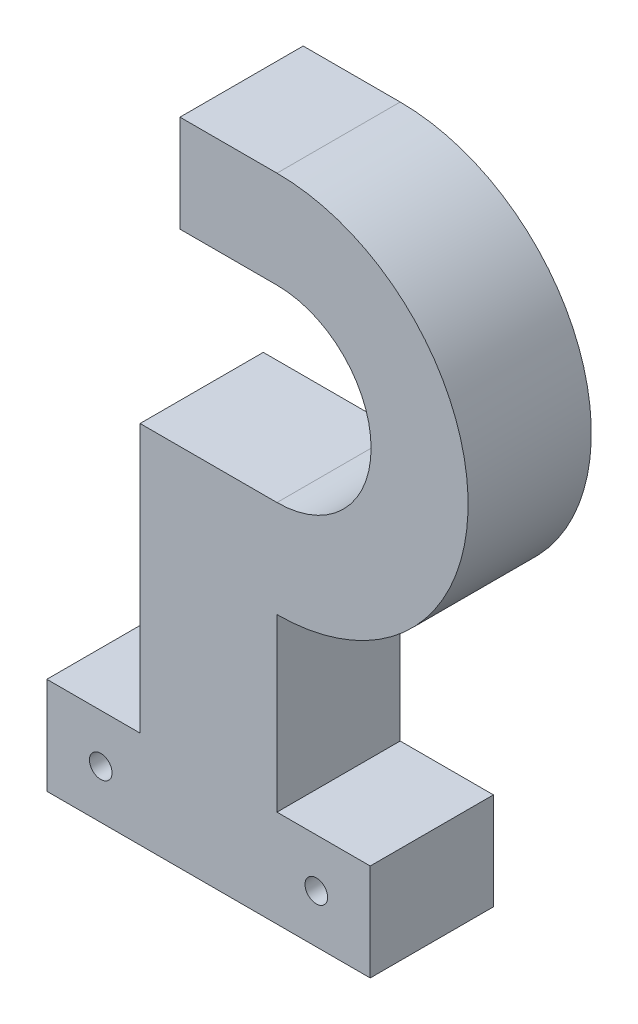
ISO-10303-21;
HEADER;
FILE_DESCRIPTION(('STEP AP214'),'2;1');
FILE_NAME('part.step','',(''),(''),'','','');
FILE_SCHEMA(('AUTOMOTIVE_DESIGN { 1 0 10303 214 1 1 1 1 }'));
ENDSEC;
DATA;
#1=APPLICATION_CONTEXT('core data for automotive mechanical design processes');
#2=APPLICATION_PROTOCOL_DEFINITION('international standard','automotive_design',2000,#1);
#3=PRODUCT_CONTEXT('',#1,'mechanical');
#4=PRODUCT('Part','Part','',(#3));
#5=PRODUCT_RELATED_PRODUCT_CATEGORY('part','',(#4));
#6=PRODUCT_DEFINITION_FORMATION('','',#4);
#7=PRODUCT_DEFINITION_CONTEXT('part definition',#1,'design');
#8=PRODUCT_DEFINITION('design','',#6,#7);
#9=PRODUCT_DEFINITION_SHAPE('','',#8);
#10=(LENGTH_UNIT() NAMED_UNIT(*) SI_UNIT(.MILLI.,.METRE.));
#11=(NAMED_UNIT(*) PLANE_ANGLE_UNIT() SI_UNIT($,.RADIAN.));
#12=(NAMED_UNIT(*) SI_UNIT($,.STERADIAN.) SOLID_ANGLE_UNIT());
#13=UNCERTAINTY_MEASURE_WITH_UNIT(LENGTH_MEASURE(1.E-05),#10,'distance_accuracy_value','');
#14=(GEOMETRIC_REPRESENTATION_CONTEXT(3) GLOBAL_UNCERTAINTY_ASSIGNED_CONTEXT((#13)) GLOBAL_UNIT_ASSIGNED_CONTEXT((#10,
#11,#12)) REPRESENTATION_CONTEXT('',''));
#15=CARTESIAN_POINT('',(0.,0.,0.));
#16=DIRECTION('',(0.,0.,1.));
#17=DIRECTION('',(1.,0.,0.));
#18=AXIS2_PLACEMENT_3D('',#15,#16,#17);
#19=CARTESIAN_POINT('',(-28.0637741,0.,-29.21));
#20=DIRECTION('',(-1.,0.,0.));
#21=DIRECTION('',(0.,0.,1.));
#22=AXIS2_PLACEMENT_3D('',#19,#20,#21);
#23=PLANE('',#22);
#24=DIRECTION('',(0.,-1.,0.));
#25=VECTOR('',#24,1.);
#26=CARTESIAN_POINT('',(-28.0637741,0.,-6.35));
#27=LINE('',#26,#25);
#28=CARTESIAN_POINT('',(-28.0637741,-30.,-6.35));
#29=VERTEX_POINT('',#28);
#30=CARTESIAN_POINT('',(-28.0637741,-79.75,-6.35));
#31=VERTEX_POINT('',#30);
#32=EDGE_CURVE('E173',#29,#31,#27,.T.);
#33=ORIENTED_EDGE('',*,*,#32,.F.);
#34=DIRECTION('',(0.,0.,1.));
#35=VECTOR('',#34,1.);
#36=CARTESIAN_POINT('',(-28.0637741,-30.,-29.21));
#37=LINE('',#36,#35);
#38=CARTESIAN_POINT('',(-28.0637741,-30.,-29.21));
#39=VERTEX_POINT('',#38);
#40=EDGE_CURVE('E11',#39,#29,#37,.T.);
#41=ORIENTED_EDGE('',*,*,#40,.F.);
#42=DIRECTION('',(0.,-1.,0.));
#43=VECTOR('',#42,1.);
#44=CARTESIAN_POINT('',(-28.0637741,0.,-29.21));
#45=LINE('',#44,#43);
#46=CARTESIAN_POINT('',(-28.0637741,-79.75,-29.21));
#47=VERTEX_POINT('',#46);
#48=EDGE_CURVE('E149',#39,#47,#45,.T.);
#49=ORIENTED_EDGE('',*,*,#48,.T.);
#50=DIRECTION('',(0.,0.,-1.));
#51=VECTOR('',#50,1.);
#52=CARTESIAN_POINT('',(-28.0637741,-79.75,-6.35));
#53=LINE('',#52,#51);
#54=EDGE_CURVE('E212',#31,#47,#53,.T.);
#55=ORIENTED_EDGE('',*,*,#54,.F.);
#56=EDGE_LOOP('',(#33,#41,#49,#55));
#57=FACE_BOUND('',#56,.T.);
#58=ADVANCED_FACE('F47',(#57),#23,.T.);
#59=CARTESIAN_POINT('',(0.,-30.,-29.21));
#60=DIRECTION('',(0.,1.,0.));
#61=DIRECTION('',(0.,0.,1.));
#62=AXIS2_PLACEMENT_3D('',#59,#60,#61);
#63=PLANE('',#62);
#64=DIRECTION('',(-1.,0.,0.));
#65=VECTOR('',#64,1.);
#66=CARTESIAN_POINT('',(0.,-30.,-6.35));
#67=LINE('',#66,#65);
#68=CARTESIAN_POINT('',(-2.66377258,-30.,-6.35));
#69=VERTEX_POINT('',#68);
#70=EDGE_CURVE('E170',#69,#29,#67,.T.);
#71=ORIENTED_EDGE('',*,*,#70,.F.);
#72=DIRECTION('',(0.,0.,1.));
#73=VECTOR('',#72,1.);
#74=CARTESIAN_POINT('',(-2.66377258,-30.,-29.21));
#75=LINE('',#74,#73);
#76=CARTESIAN_POINT('',(-2.66377258,-30.,-29.21));
#77=VERTEX_POINT('',#76);
#78=EDGE_CURVE('E58',#77,#69,#75,.T.);
#79=ORIENTED_EDGE('',*,*,#78,.F.);
#80=DIRECTION('',(-1.,0.,0.));
#81=VECTOR('',#80,1.);
#82=CARTESIAN_POINT('',(0.,-30.,-29.21));
#83=LINE('',#82,#81);
#84=EDGE_CURVE('E126',#77,#39,#83,.T.);
#85=ORIENTED_EDGE('',*,*,#84,.T.);
#86=ORIENTED_EDGE('',*,*,#40,.T.);
#87=EDGE_LOOP('',(#71,#79,#85,#86));
#88=FACE_BOUND('',#87,.T.);
#89=ADVANCED_FACE('F222',(#88),#63,.T.);
#90=CARTESIAN_POINT('',(-2.66377258000001,-12.5375,-29.21));
#91=DIRECTION('',(0.,0.,1.));
#92=DIRECTION('',(1.,0.,0.));
#93=AXIS2_PLACEMENT_3D('',#90,#91,#92);
#94=CYLINDRICAL_SURFACE('',#93,17.4625);
#95=CARTESIAN_POINT('',(-2.66377258000001,-12.5375,-6.35));
#96=DIRECTION('',(0.,0.,1.));
#97=DIRECTION('',(1.,0.,0.));
#98=AXIS2_PLACEMENT_3D('',#95,#96,#97);
#99=CIRCLE('',#98,17.4625);
#100=CARTESIAN_POINT('',(-2.66377257999999,4.925,-6.35));
#101=VERTEX_POINT('',#100);
#102=EDGE_CURVE('E131',#69,#101,#99,.T.);
#103=ORIENTED_EDGE('',*,*,#102,.T.);
#104=DIRECTION('',(0.,0.,1.));
#105=VECTOR('',#104,1.);
#106=CARTESIAN_POINT('',(-2.66377257999999,4.925,-29.21));
#107=LINE('',#106,#105);
#108=CARTESIAN_POINT('',(-2.66377257999999,4.925,-29.21));
#109=VERTEX_POINT('',#108);
#110=EDGE_CURVE('E129',#109,#101,#107,.T.);
#111=ORIENTED_EDGE('',*,*,#110,.F.);
#112=CARTESIAN_POINT('',(-2.66377258000001,-12.5375,-29.21));
#113=DIRECTION('',(0.,0.,1.));
#114=DIRECTION('',(1.,0.,0.));
#115=AXIS2_PLACEMENT_3D('',#112,#113,#114);
#116=CIRCLE('',#115,17.4625);
#117=EDGE_CURVE('E117',#77,#109,#116,.T.);
#118=ORIENTED_EDGE('',*,*,#117,.F.);
#119=ORIENTED_EDGE('',*,*,#78,.T.);
#120=EDGE_LOOP('',(#103,#111,#118,#119));
#121=FACE_BOUND('',#120,.T.);
#122=ADVANCED_FACE('F130',(#121),#94,.F.);
#123=CARTESIAN_POINT('',(0.,4.925,-29.21));
#124=DIRECTION('',(0.,-1.,0.));
#125=DIRECTION('',(0.,0.,-1.));
#126=AXIS2_PLACEMENT_3D('',#123,#124,#125);
#127=PLANE('',#126);
#128=DIRECTION('',(1.,0.,0.));
#129=VECTOR('',#128,1.);
#130=CARTESIAN_POINT('',(0.,4.925,-6.35));
#131=LINE('',#130,#129);
#132=CARTESIAN_POINT('',(-20.6637745,4.925,-6.35));
#133=VERTEX_POINT('',#132);
#134=EDGE_CURVE('E165',#133,#101,#131,.T.);
#135=ORIENTED_EDGE('',*,*,#134,.F.);
#136=DIRECTION('',(0.,0.,1.));
#137=VECTOR('',#136,1.);
#138=CARTESIAN_POINT('',(-20.6637745,4.925,-29.21));
#139=LINE('',#138,#137);
#140=CARTESIAN_POINT('',(-20.6637745,4.925,-29.21));
#141=VERTEX_POINT('',#140);
#142=EDGE_CURVE('E136',#141,#133,#139,.T.);
#143=ORIENTED_EDGE('',*,*,#142,.F.);
#144=DIRECTION('',(1.,0.,0.));
#145=VECTOR('',#144,1.);
#146=CARTESIAN_POINT('',(0.,4.925,-29.21));
#147=LINE('',#146,#145);
#148=EDGE_CURVE('E123',#141,#109,#147,.T.);
#149=ORIENTED_EDGE('',*,*,#148,.T.);
#150=ORIENTED_EDGE('',*,*,#110,.T.);
#151=EDGE_LOOP('',(#135,#143,#149,#150));
#152=FACE_BOUND('',#151,.T.);
#153=ADVANCED_FACE('F138',(#152),#127,.T.);
#154=CARTESIAN_POINT('',(-20.6637745,0.,-29.21));
#155=DIRECTION('',(-1.,0.,0.));
#156=DIRECTION('',(0.,0.,1.));
#157=AXIS2_PLACEMENT_3D('',#154,#155,#156);
#158=PLANE('',#157);
#159=DIRECTION('',(0.,-1.,0.));
#160=VECTOR('',#159,1.);
#161=CARTESIAN_POINT('',(-20.6637745,0.,-6.35));
#162=LINE('',#161,#160);
#163=CARTESIAN_POINT('',(-20.6637745,22.925,-6.35));
#164=VERTEX_POINT('',#163);
#165=EDGE_CURVE('E161',#164,#133,#162,.T.);
#166=ORIENTED_EDGE('',*,*,#165,.F.);
#167=DIRECTION('',(0.,0.,1.));
#168=VECTOR('',#167,1.);
#169=CARTESIAN_POINT('',(-20.6637745,22.925,-29.21));
#170=LINE('',#169,#168);
#171=CARTESIAN_POINT('',(-20.6637745,22.925,-29.21));
#172=VERTEX_POINT('',#171);
#173=EDGE_CURVE('E182',#172,#164,#170,.T.);
#174=ORIENTED_EDGE('',*,*,#173,.F.);
#175=DIRECTION('',(0.,-1.,0.));
#176=VECTOR('',#175,1.);
#177=CARTESIAN_POINT('',(-20.6637745,0.,-29.21));
#178=LINE('',#177,#176);
#179=EDGE_CURVE('E140',#172,#141,#178,.T.);
#180=ORIENTED_EDGE('',*,*,#179,.T.);
#181=ORIENTED_EDGE('',*,*,#142,.T.);
#182=EDGE_LOOP('',(#166,#174,#180,#181));
#183=FACE_BOUND('',#182,.T.);
#184=ADVANCED_FACE('F221',(#183),#158,.T.);
#185=CARTESIAN_POINT('',(0.,22.925,-29.21));
#186=DIRECTION('',(0.,1.,0.));
#187=DIRECTION('',(0.,0.,1.));
#188=AXIS2_PLACEMENT_3D('',#185,#186,#187);
#189=PLANE('',#188);
#190=DIRECTION('',(-1.,0.,0.));
#191=VECTOR('',#190,1.);
#192=CARTESIAN_POINT('',(0.,22.925,-6.35));
#193=LINE('',#192,#191);
#194=CARTESIAN_POINT('',(-2.66377257999999,22.925,-6.35));
#195=VERTEX_POINT('',#194);
#196=EDGE_CURVE('E156',#195,#164,#193,.T.);
#197=ORIENTED_EDGE('',*,*,#196,.F.);
#198=DIRECTION('',(0.,0.,1.));
#199=VECTOR('',#198,1.);
#200=CARTESIAN_POINT('',(-2.66377257999999,22.925,-29.21));
#201=LINE('',#200,#199);
#202=CARTESIAN_POINT('',(-2.66377257999999,22.925,-29.21));
#203=VERTEX_POINT('',#202);
#204=EDGE_CURVE('E103',#203,#195,#201,.T.);
#205=ORIENTED_EDGE('',*,*,#204,.F.);
#206=DIRECTION('',(-1.,0.,0.));
#207=VECTOR('',#206,1.);
#208=CARTESIAN_POINT('',(0.,22.925,-29.21));
#209=LINE('',#208,#207);
#210=EDGE_CURVE('E143',#203,#172,#209,.T.);
#211=ORIENTED_EDGE('',*,*,#210,.T.);
#212=ORIENTED_EDGE('',*,*,#173,.T.);
#213=EDGE_LOOP('',(#197,#205,#211,#212));
#214=FACE_BOUND('',#213,.T.);
#215=ADVANCED_FACE('F218',(#214),#189,.T.);
#216=CARTESIAN_POINT('',(-2.66377258,-12.5375,-29.21));
#217=DIRECTION('',(0.,0.,1.));
#218=DIRECTION('',(1.,0.,0.));
#219=AXIS2_PLACEMENT_3D('',#216,#217,#218);
#220=CYLINDRICAL_SURFACE('',#219,35.4625);
#221=CARTESIAN_POINT('',(-2.66377258,-12.5375,-6.35));
#222=DIRECTION('',(0.,0.,1.));
#223=DIRECTION('',(1.,0.,0.));
#224=AXIS2_PLACEMENT_3D('',#221,#222,#223);
#225=CIRCLE('',#224,35.4625);
#226=CARTESIAN_POINT('',(-2.66377258,-48.,-6.35));
#227=VERTEX_POINT('',#226);
#228=EDGE_CURVE('E152',#227,#195,#225,.T.);
#229=ORIENTED_EDGE('',*,*,#228,.F.);
#230=DIRECTION('',(0.,0.,1.));
#231=VECTOR('',#230,1.);
#232=CARTESIAN_POINT('',(-2.66377258,-48.,-29.21));
#233=LINE('',#232,#231);
#234=CARTESIAN_POINT('',(-2.66377258,-48.,-29.21));
#235=VERTEX_POINT('',#234);
#236=EDGE_CURVE('E51',#235,#227,#233,.T.);
#237=ORIENTED_EDGE('',*,*,#236,.F.);
#238=CARTESIAN_POINT('',(-2.66377258,-12.5375,-29.21));
#239=DIRECTION('',(0.,0.,1.));
#240=DIRECTION('',(1.,0.,0.));
#241=AXIS2_PLACEMENT_3D('',#238,#239,#240);
#242=CIRCLE('',#241,35.4625);
#243=EDGE_CURVE('E176',#235,#203,#242,.T.);
#244=ORIENTED_EDGE('',*,*,#243,.T.);
#245=ORIENTED_EDGE('',*,*,#204,.T.);
#246=EDGE_LOOP('',(#229,#237,#244,#245));
#247=FACE_BOUND('',#246,.T.);
#248=ADVANCED_FACE('F49',(#247),#220,.T.);
#249=CARTESIAN_POINT('',(0.,0.,-29.21));
#250=DIRECTION('',(0.,0.,1.));
#251=DIRECTION('',(1.,0.,0.));
#252=AXIS2_PLACEMENT_3D('',#249,#250,#251);
#253=PLANE('',#252);
#254=CARTESIAN_POINT('',(4.636226792,-88.750000034,-29.21));
#255=DIRECTION('',(0.,0.,1.));
#256=DIRECTION('',(1.,0.,0.));
#257=AXIS2_PLACEMENT_3D('',#254,#255,#256);
#258=CIRCLE('',#257,2.10000176900001);
#259=CARTESIAN_POINT('',(6.736228561,-88.750000034,-29.21));
#260=VERTEX_POINT('',#259);
#261=EDGE_CURVE('E271',#260,#260,#258,.T.);
#262=ORIENTED_EDGE('',*,*,#261,.T.);
#263=EDGE_LOOP('',(#262));
#264=FACE_BOUND('',#263,.T.);
#265=CARTESIAN_POINT('',(-35.363773472,-88.750000034,-29.21));
#266=DIRECTION('',(0.,0.,1.));
#267=DIRECTION('',(1.,0.,0.));
#268=AXIS2_PLACEMENT_3D('',#265,#266,#267);
#269=CIRCLE('',#268,2.100001769);
#270=CARTESIAN_POINT('',(-33.263771703,-88.750000034,-29.21));
#271=VERTEX_POINT('',#270);
#272=EDGE_CURVE('E286',#271,#271,#269,.T.);
#273=ORIENTED_EDGE('',*,*,#272,.T.);
#274=EDGE_LOOP('',(#273));
#275=FACE_BOUND('',#274,.T.);
#276=ORIENTED_EDGE('',*,*,#243,.F.);
#277=DIRECTION('',(0.,1.,0.));
#278=VECTOR('',#277,1.);
#279=CARTESIAN_POINT('',(-2.66377258,-79.75,-29.21));
#280=LINE('',#279,#278);
#281=CARTESIAN_POINT('',(-2.66377258,-79.75,-29.21));
#282=VERTEX_POINT('',#281);
#283=EDGE_CURVE('E157',#282,#235,#280,.T.);
#284=ORIENTED_EDGE('',*,*,#283,.F.);
#285=DIRECTION('',(1.,0.,0.));
#286=VECTOR('',#285,1.);
#287=CARTESIAN_POINT('',(-15.36377334,-79.75,-29.21));
#288=LINE('',#287,#286);
#289=CARTESIAN_POINT('',(14.636226604,-79.75,-29.21));
#290=VERTEX_POINT('',#289);
#291=EDGE_CURVE('E274',#282,#290,#288,.T.);
#292=ORIENTED_EDGE('',*,*,#291,.T.);
#293=DIRECTION('',(0.,1.,0.));
#294=VECTOR('',#293,1.);
#295=CARTESIAN_POINT('',(14.636226604,-97.750000068,-29.21));
#296=LINE('',#295,#294);
#297=CARTESIAN_POINT('',(14.636226604,-97.750000068,-29.21));
#298=VERTEX_POINT('',#297);
#299=EDGE_CURVE('E275',#298,#290,#296,.T.);
#300=ORIENTED_EDGE('',*,*,#299,.F.);
#301=DIRECTION('',(1.,0.,0.));
#302=VECTOR('',#301,1.);
#303=CARTESIAN_POINT('',(-45.363773284,-97.750000068,-29.21));
#304=LINE('',#303,#302);
#305=CARTESIAN_POINT('',(-45.363773284,-97.750000068,-29.21));
#306=VERTEX_POINT('',#305);
#307=EDGE_CURVE('E279',#306,#298,#304,.T.);
#308=ORIENTED_EDGE('',*,*,#307,.F.);
#309=DIRECTION('',(0.,-1.,0.));
#310=VECTOR('',#309,1.);
#311=CARTESIAN_POINT('',(-45.363773284,-79.75,-29.21));
#312=LINE('',#311,#310);
#313=CARTESIAN_POINT('',(-45.363773284,-79.75,-29.21));
#314=VERTEX_POINT('',#313);
#315=EDGE_CURVE('E259',#314,#306,#312,.T.);
#316=ORIENTED_EDGE('',*,*,#315,.F.);
#317=EDGE_CURVE('E227',#314,#47,#288,.T.);
#318=ORIENTED_EDGE('',*,*,#317,.T.);
#319=ORIENTED_EDGE('',*,*,#48,.F.);
#320=ORIENTED_EDGE('',*,*,#84,.F.);
#321=ORIENTED_EDGE('',*,*,#117,.T.);
#322=ORIENTED_EDGE('',*,*,#148,.F.);
#323=ORIENTED_EDGE('',*,*,#179,.F.);
#324=ORIENTED_EDGE('',*,*,#210,.F.);
#325=EDGE_LOOP('',(#276,#284,#292,#300,#308,#316,#318,#319,#320,#321,#322,#323,#324));
#326=FACE_BOUND('',#325,.T.);
#327=ADVANCED_FACE('F120',(#264,#275,#326),#253,.F.);
#328=CARTESIAN_POINT('',(0.,0.,-6.35));
#329=DIRECTION('',(0.,0.,1.));
#330=DIRECTION('',(1.,0.,0.));
#331=AXIS2_PLACEMENT_3D('',#328,#329,#330);
#332=PLANE('',#331);
#333=CARTESIAN_POINT('',(4.636226792,-88.750000034,-6.35));
#334=DIRECTION('',(0.,0.,1.));
#335=DIRECTION('',(1.,0.,0.));
#336=AXIS2_PLACEMENT_3D('',#333,#334,#335);
#337=CIRCLE('',#336,2.10000176900001);
#338=CARTESIAN_POINT('',(6.736228561,-88.750000034,-6.35));
#339=VERTEX_POINT('',#338);
#340=EDGE_CURVE('E294',#339,#339,#337,.T.);
#341=ORIENTED_EDGE('',*,*,#340,.F.);
#342=EDGE_LOOP('',(#341));
#343=FACE_BOUND('',#342,.T.);
#344=CARTESIAN_POINT('',(-35.363773472,-88.750000034,-6.35));
#345=DIRECTION('',(0.,0.,1.));
#346=DIRECTION('',(1.,0.,0.));
#347=AXIS2_PLACEMENT_3D('',#344,#345,#346);
#348=CIRCLE('',#347,2.100001769);
#349=CARTESIAN_POINT('',(-33.263771703,-88.750000034,-6.35));
#350=VERTEX_POINT('',#349);
#351=EDGE_CURVE('E290',#350,#350,#348,.T.);
#352=ORIENTED_EDGE('',*,*,#351,.F.);
#353=EDGE_LOOP('',(#352));
#354=FACE_BOUND('',#353,.T.);
#355=ORIENTED_EDGE('',*,*,#32,.T.);
#356=DIRECTION('',(-1.,0.,0.));
#357=VECTOR('',#356,1.);
#358=CARTESIAN_POINT('',(-15.36377334,-79.75,-6.35));
#359=LINE('',#358,#357);
#360=CARTESIAN_POINT('',(-45.363773284,-79.75,-6.35));
#361=VERTEX_POINT('',#360);
#362=EDGE_CURVE('E239',#31,#361,#359,.T.);
#363=ORIENTED_EDGE('',*,*,#362,.T.);
#364=DIRECTION('',(0.,-1.,0.));
#365=VECTOR('',#364,1.);
#366=CARTESIAN_POINT('',(-45.363773284,-79.75,-6.35));
#367=LINE('',#366,#365);
#368=CARTESIAN_POINT('',(-45.363773284,-97.750000068,-6.35));
#369=VERTEX_POINT('',#368);
#370=EDGE_CURVE('E267',#361,#369,#367,.T.);
#371=ORIENTED_EDGE('',*,*,#370,.T.);
#372=DIRECTION('',(1.,0.,0.));
#373=VECTOR('',#372,1.);
#374=CARTESIAN_POINT('',(-45.363773284,-97.750000068,-6.35));
#375=LINE('',#374,#373);
#376=CARTESIAN_POINT('',(14.636226604,-97.750000068,-6.35));
#377=VERTEX_POINT('',#376);
#378=EDGE_CURVE('E263',#369,#377,#375,.T.);
#379=ORIENTED_EDGE('',*,*,#378,.T.);
#380=DIRECTION('',(0.,1.,0.));
#381=VECTOR('',#380,1.);
#382=CARTESIAN_POINT('',(14.636226604,-97.750000068,-6.35));
#383=LINE('',#382,#381);
#384=CARTESIAN_POINT('',(14.636226604,-79.75,-6.35));
#385=VERTEX_POINT('',#384);
#386=EDGE_CURVE('E260',#377,#385,#383,.T.);
#387=ORIENTED_EDGE('',*,*,#386,.T.);
#388=CARTESIAN_POINT('',(-2.66377258,-79.75,-6.35));
#389=VERTEX_POINT('',#388);
#390=EDGE_CURVE('E205',#385,#389,#359,.T.);
#391=ORIENTED_EDGE('',*,*,#390,.T.);
#392=DIRECTION('',(0.,1.,0.));
#393=VECTOR('',#392,1.);
#394=CARTESIAN_POINT('',(-2.66377258,-79.75,-6.35));
#395=LINE('',#394,#393);
#396=EDGE_CURVE('E197',#389,#227,#395,.T.);
#397=ORIENTED_EDGE('',*,*,#396,.T.);
#398=ORIENTED_EDGE('',*,*,#228,.T.);
#399=ORIENTED_EDGE('',*,*,#196,.T.);
#400=ORIENTED_EDGE('',*,*,#165,.T.);
#401=ORIENTED_EDGE('',*,*,#134,.T.);
#402=ORIENTED_EDGE('',*,*,#102,.F.);
#403=ORIENTED_EDGE('',*,*,#70,.T.);
#404=EDGE_LOOP('',(#355,#363,#371,#379,#387,#391,#397,#398,#399,#400,#401,#402,#403));
#405=FACE_BOUND('',#404,.T.);
#406=ADVANCED_FACE('F201',(#343,#354,#405),#332,.T.);
#407=CARTESIAN_POINT('',(-2.66377258,-79.75,-6.35));
#408=DIRECTION('',(-1.,0.,0.));
#409=DIRECTION('',(0.,0.,1.));
#410=AXIS2_PLACEMENT_3D('',#407,#408,#409);
#411=PLANE('',#410);
#412=ORIENTED_EDGE('',*,*,#236,.T.);
#413=ORIENTED_EDGE('',*,*,#396,.F.);
#414=DIRECTION('',(0.,0.,1.));
#415=VECTOR('',#414,1.);
#416=CARTESIAN_POINT('',(-2.66377258,-79.75,-6.35));
#417=LINE('',#416,#415);
#418=EDGE_CURVE('E207',#282,#389,#417,.T.);
#419=ORIENTED_EDGE('',*,*,#418,.F.);
#420=ORIENTED_EDGE('',*,*,#283,.T.);
#421=EDGE_LOOP('',(#412,#413,#419,#420));
#422=FACE_BOUND('',#421,.T.);
#423=ADVANCED_FACE('F194',(#422),#411,.F.);
#424=CARTESIAN_POINT('',(-15.36377334,-79.75,-29.21));
#425=DIRECTION('',(0.,1.,0.));
#426=DIRECTION('',(0.,0.,1.));
#427=AXIS2_PLACEMENT_3D('',#424,#425,#426);
#428=PLANE('',#427);
#429=ORIENTED_EDGE('',*,*,#362,.F.);
#430=ORIENTED_EDGE('',*,*,#54,.T.);
#431=ORIENTED_EDGE('',*,*,#317,.F.);
#432=DIRECTION('',(0.,0.,1.));
#433=VECTOR('',#432,1.);
#434=CARTESIAN_POINT('',(-45.363773284,-79.75,-29.21));
#435=LINE('',#434,#433);
#436=EDGE_CURVE('E241',#314,#361,#435,.T.);
#437=ORIENTED_EDGE('',*,*,#436,.T.);
#438=EDGE_LOOP('',(#429,#430,#431,#437));
#439=FACE_BOUND('',#438,.T.);
#440=ADVANCED_FACE('F234',(#439),#428,.T.);
#441=CARTESIAN_POINT('',(-45.363773284,-79.75,-29.21));
#442=DIRECTION('',(-1.,0.,0.));
#443=DIRECTION('',(0.,0.,1.));
#444=AXIS2_PLACEMENT_3D('',#441,#442,#443);
#445=PLANE('',#444);
#446=ORIENTED_EDGE('',*,*,#370,.F.);
#447=ORIENTED_EDGE('',*,*,#436,.F.);
#448=ORIENTED_EDGE('',*,*,#315,.T.);
#449=DIRECTION('',(0.,0.,1.));
#450=VECTOR('',#449,1.);
#451=CARTESIAN_POINT('',(-45.363773284,-97.750000068,-29.21));
#452=LINE('',#451,#450);
#453=EDGE_CURVE('E246',#306,#369,#452,.T.);
#454=ORIENTED_EDGE('',*,*,#453,.T.);
#455=EDGE_LOOP('',(#446,#447,#448,#454));
#456=FACE_BOUND('',#455,.T.);
#457=ADVANCED_FACE('F353',(#456),#445,.T.);
#458=ORIENTED_EDGE('',*,*,#291,.F.);
#459=ORIENTED_EDGE('',*,*,#418,.T.);
#460=ORIENTED_EDGE('',*,*,#390,.F.);
#461=DIRECTION('',(0.,0.,1.));
#462=VECTOR('',#461,1.);
#463=CARTESIAN_POINT('',(14.636226604,-79.75,-29.21));
#464=LINE('',#463,#462);
#465=EDGE_CURVE('E243',#290,#385,#464,.T.);
#466=ORIENTED_EDGE('',*,*,#465,.F.);
#467=EDGE_LOOP('',(#458,#459,#460,#466));
#468=FACE_BOUND('',#467,.T.);
#469=ADVANCED_FACE('F355',(#468),#428,.T.);
#470=CARTESIAN_POINT('',(14.636226604,-97.750000068,-29.21));
#471=DIRECTION('',(1.,0.,0.));
#472=DIRECTION('',(0.,1.,0.));
#473=AXIS2_PLACEMENT_3D('',#470,#471,#472);
#474=PLANE('',#473);
#475=ORIENTED_EDGE('',*,*,#386,.F.);
#476=DIRECTION('',(0.,0.,1.));
#477=VECTOR('',#476,1.);
#478=CARTESIAN_POINT('',(14.636226604,-97.750000068,-29.21));
#479=LINE('',#478,#477);
#480=EDGE_CURVE('E250',#298,#377,#479,.T.);
#481=ORIENTED_EDGE('',*,*,#480,.F.);
#482=ORIENTED_EDGE('',*,*,#299,.T.);
#483=ORIENTED_EDGE('',*,*,#465,.T.);
#484=EDGE_LOOP('',(#475,#481,#482,#483));
#485=FACE_BOUND('',#484,.T.);
#486=ADVANCED_FACE('F323',(#485),#474,.T.);
#487=CARTESIAN_POINT('',(-45.363773284,-97.750000068,-29.21));
#488=DIRECTION('',(0.,-1.,0.));
#489=DIRECTION('',(0.,0.,-1.));
#490=AXIS2_PLACEMENT_3D('',#487,#488,#489);
#491=PLANE('',#490);
#492=ORIENTED_EDGE('',*,*,#378,.F.);
#493=ORIENTED_EDGE('',*,*,#453,.F.);
#494=ORIENTED_EDGE('',*,*,#307,.T.);
#495=ORIENTED_EDGE('',*,*,#480,.T.);
#496=EDGE_LOOP('',(#492,#493,#494,#495));
#497=FACE_BOUND('',#496,.T.);
#498=ADVANCED_FACE('F317',(#497),#491,.T.);
#499=CARTESIAN_POINT('',(-35.363773472,-88.750000034,-29.21));
#500=DIRECTION('',(0.,0.,1.));
#501=DIRECTION('',(1.,0.,0.));
#502=AXIS2_PLACEMENT_3D('',#499,#500,#501);
#503=CYLINDRICAL_SURFACE('',#502,2.100001769);
#504=ORIENTED_EDGE('',*,*,#272,.F.);
#505=EDGE_LOOP('',(#504));
#506=FACE_BOUND('',#505,.T.);
#507=ORIENTED_EDGE('',*,*,#351,.T.);
#508=EDGE_LOOP('',(#507));
#509=FACE_BOUND('',#508,.T.);
#510=ADVANCED_FACE('F307',(#506,#509),#503,.F.);
#511=CARTESIAN_POINT('',(4.636226792,-88.750000034,-29.21));
#512=DIRECTION('',(0.,0.,1.));
#513=DIRECTION('',(1.,0.,0.));
#514=AXIS2_PLACEMENT_3D('',#511,#512,#513);
#515=CYLINDRICAL_SURFACE('',#514,2.10000176900001);
#516=ORIENTED_EDGE('',*,*,#261,.F.);
#517=EDGE_LOOP('',(#516));
#518=FACE_BOUND('',#517,.T.);
#519=ORIENTED_EDGE('',*,*,#340,.T.);
#520=EDGE_LOOP('',(#519));
#521=FACE_BOUND('',#520,.T.);
#522=ADVANCED_FACE('F304',(#518,#521),#515,.F.);
#523=CLOSED_SHELL('',(#58,#89,#122,#153,#184,#215,#248,#327,#406,#423,#440,#457,#469,#486,#498,
#510,#522));
#524=MANIFOLD_SOLID_BREP('B2',#523);
#525=ADVANCED_BREP_SHAPE_REPRESENTATION('',(#18,#524),#14);
#526=SHAPE_DEFINITION_REPRESENTATION(#9,#525);
ENDSEC;
END-ISO-10303-21;
